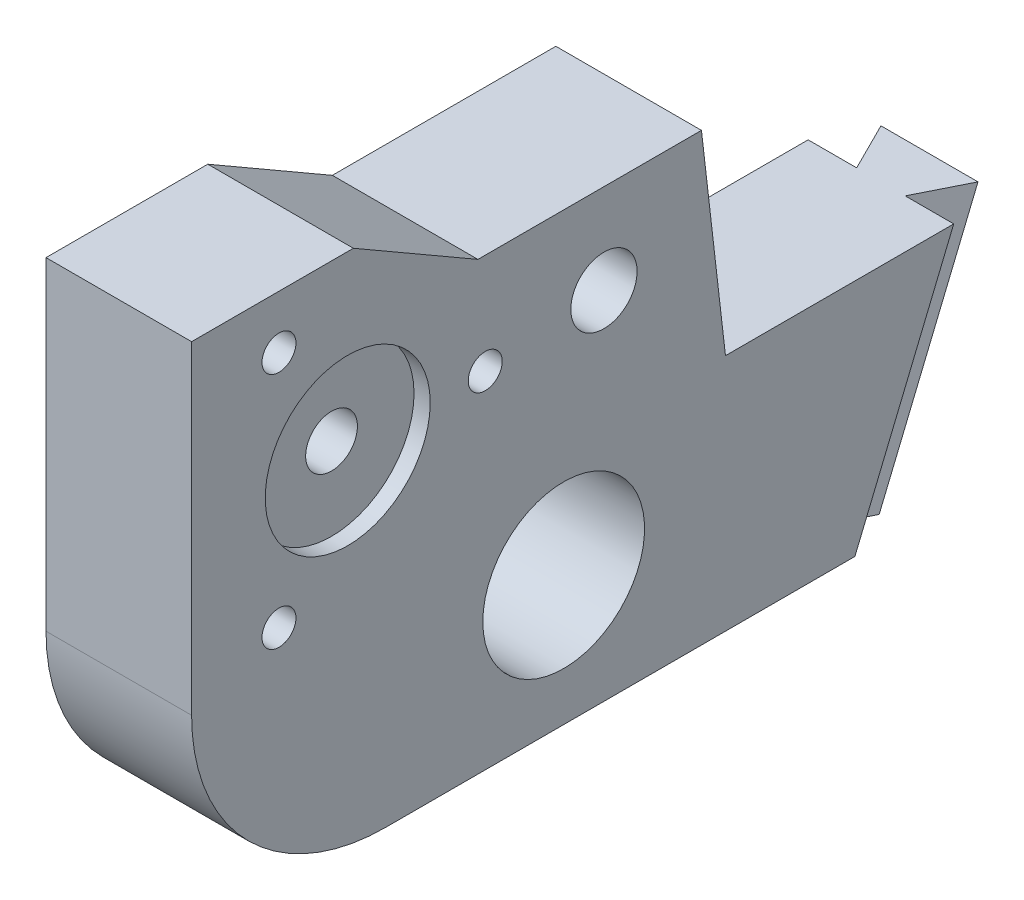
ISO-10303-21;
HEADER;
FILE_DESCRIPTION(('STEP AP214'),'2;1');
FILE_NAME('part.step','',(''),(''),'','','');
FILE_SCHEMA(('AUTOMOTIVE_DESIGN { 1 0 10303 214 1 1 1 1 }'));
ENDSEC;
DATA;
#1=APPLICATION_CONTEXT('core data for automotive mechanical design processes');
#2=APPLICATION_PROTOCOL_DEFINITION('international standard','automotive_design',2000,#1);
#3=PRODUCT_CONTEXT('',#1,'mechanical');
#4=PRODUCT('Part','Part','',(#3));
#5=PRODUCT_RELATED_PRODUCT_CATEGORY('part','',(#4));
#6=PRODUCT_DEFINITION_FORMATION('','',#4);
#7=PRODUCT_DEFINITION_CONTEXT('part definition',#1,'design');
#8=PRODUCT_DEFINITION('design','',#6,#7);
#9=PRODUCT_DEFINITION_SHAPE('','',#8);
#10=(LENGTH_UNIT() NAMED_UNIT(*) SI_UNIT(.MILLI.,.METRE.));
#11=(NAMED_UNIT(*) PLANE_ANGLE_UNIT() SI_UNIT($,.RADIAN.));
#12=(NAMED_UNIT(*) SI_UNIT($,.STERADIAN.) SOLID_ANGLE_UNIT());
#13=UNCERTAINTY_MEASURE_WITH_UNIT(LENGTH_MEASURE(1.E-05),#10,'distance_accuracy_value','');
#14=(GEOMETRIC_REPRESENTATION_CONTEXT(3) GLOBAL_UNCERTAINTY_ASSIGNED_CONTEXT((#13)) GLOBAL_UNIT_ASSIGNED_CONTEXT((#10,
#11,#12)) REPRESENTATION_CONTEXT('',''));
#15=CARTESIAN_POINT('',(0.,0.,0.));
#16=DIRECTION('',(0.,0.,1.));
#17=DIRECTION('',(1.,0.,0.));
#18=AXIS2_PLACEMENT_3D('',#15,#16,#17);
#19=CARTESIAN_POINT('',(7.,0.,0.));
#20=DIRECTION('',(-1.,0.,0.));
#21=DIRECTION('',(0.,0.,1.));
#22=AXIS2_PLACEMENT_3D('',#19,#20,#21);
#23=PLANE('',#22);
#24=CARTESIAN_POINT('',(7.,0.,28.));
#25=DIRECTION('',(-1.,0.,0.));
#26=DIRECTION('',(0.,0.,1.));
#27=AXIS2_PLACEMENT_3D('',#24,#25,#26);
#28=CIRCLE('',#27,5.);
#29=CARTESIAN_POINT('',(7.,0.,33.));
#30=VERTEX_POINT('',#29);
#31=EDGE_CURVE('E184',#30,#30,#28,.T.);
#32=ORIENTED_EDGE('',*,*,#31,.T.);
#33=EDGE_LOOP('',(#32));
#34=FACE_BOUND('',#33,.T.);
#35=CARTESIAN_POINT('',(7.,5.98854455980905,45.5997604919769));
#36=DIRECTION('',(-1.,0.,0.));
#37=DIRECTION('',(0.,0.,1.));
#38=AXIS2_PLACEMENT_3D('',#35,#36,#37);
#39=CIRCLE('',#38,1.05);
#40=CARTESIAN_POINT('',(7.,5.98854455980905,46.6497604919769));
#41=VERTEX_POINT('',#40);
#42=EDGE_CURVE('E233',#41,#41,#39,.T.);
#43=ORIENTED_EDGE('',*,*,#42,.T.);
#44=EDGE_LOOP('',(#43));
#45=FACE_BOUND('',#44,.T.);
#46=CARTESIAN_POINT('',(7.,20.7109764241445,45.5997604919769));
#47=DIRECTION('',(-1.,0.,0.));
#48=DIRECTION('',(0.,0.,1.));
#49=AXIS2_PLACEMENT_3D('',#46,#47,#48);
#50=CIRCLE('',#49,1.05);
#51=CARTESIAN_POINT('',(7.,20.7109764241445,46.6497604919769));
#52=VERTEX_POINT('',#51);
#53=EDGE_CURVE('E247',#52,#52,#50,.T.);
#54=ORIENTED_EDGE('',*,*,#53,.T.);
#55=EDGE_LOOP('',(#54));
#56=FACE_BOUND('',#55,.T.);
#57=CARTESIAN_POINT('',(7.,13.3497604919768,32.8497604919769));
#58=DIRECTION('',(-1.,0.,0.));
#59=DIRECTION('',(0.,0.,1.));
#60=AXIS2_PLACEMENT_3D('',#57,#58,#59);
#61=CIRCLE('',#60,1.05);
#62=CARTESIAN_POINT('',(7.,13.3497604919768,33.8997604919769));
#63=VERTEX_POINT('',#62);
#64=EDGE_CURVE('E259',#63,#63,#61,.T.);
#65=ORIENTED_EDGE('',*,*,#64,.T.);
#66=EDGE_LOOP('',(#65));
#67=FACE_BOUND('',#66,.T.);
#68=CARTESIAN_POINT('',(7.,13.3497604919768,41.3497604919769));
#69=DIRECTION('',(1.,0.,0.));
#70=DIRECTION('',(0.,0.,-1.));
#71=AXIS2_PLACEMENT_3D('',#68,#69,#70);
#72=CIRCLE('',#71,5.09999999999999);
#73=CARTESIAN_POINT('',(7.,13.3497604919768,36.2497604919769));
#74=VERTEX_POINT('',#73);
#75=EDGE_CURVE('E280',#74,#74,#72,.T.);
#76=ORIENTED_EDGE('',*,*,#75,.F.);
#77=EDGE_LOOP('',(#76));
#78=FACE_BOUND('',#77,.T.);
#79=CARTESIAN_POINT('',(7.,14.,25.5107624657242));
#80=DIRECTION('',(-1.,0.,0.));
#81=DIRECTION('',(0.,0.,1.));
#82=AXIS2_PLACEMENT_3D('',#79,#80,#81);
#83=CIRCLE('',#82,2.05);
#84=CARTESIAN_POINT('',(7.,14.,27.5607624657242));
#85=VERTEX_POINT('',#84);
#86=EDGE_CURVE('E283',#85,#85,#83,.T.);
#87=ORIENTED_EDGE('',*,*,#86,.T.);
#88=EDGE_LOOP('',(#87));
#89=FACE_BOUND('',#88,.T.);
#90=DIRECTION('',(0.,0.,-1.));
#91=VECTOR('',#90,1.);
#92=CARTESIAN_POINT('',(7.,19.5546522376059,0.));
#93=LINE('',#92,#91);
#94=CARTESIAN_POINT('',(7.,19.5546522376059,33.3004318182208));
#95=VERTEX_POINT('',#94);
#96=CARTESIAN_POINT('',(7.,19.5546522376059,19.4845973608818));
#97=VERTEX_POINT('',#96);
#98=EDGE_CURVE('E52',#95,#97,#93,.T.);
#99=ORIENTED_EDGE('',*,*,#98,.F.);
#100=DIRECTION('',(0.,-0.5,-0.866025403784438));
#101=VECTOR('',#100,1.);
#102=CARTESIAN_POINT('',(7.,0.246479222419,-0.14230484541326));
#103=LINE('',#102,#101);
#104=CARTESIAN_POINT('',(7.,24.,41.));
#105=VERTEX_POINT('',#104);
#106=EDGE_CURVE('E56',#105,#95,#103,.T.);
#107=ORIENTED_EDGE('',*,*,#106,.F.);
#108=DIRECTION('',(0.,0.,-1.));
#109=VECTOR('',#108,1.);
#110=CARTESIAN_POINT('',(7.,24.,51.));
#111=LINE('',#110,#109);
#112=CARTESIAN_POINT('',(7.,24.,51.));
#113=VERTEX_POINT('',#112);
#114=EDGE_CURVE('E176',#113,#105,#111,.T.);
#115=ORIENTED_EDGE('',*,*,#114,.F.);
#116=DIRECTION('',(0.,1.,0.));
#117=VECTOR('',#116,1.);
#118=CARTESIAN_POINT('',(7.,-7.99999999999999,51.));
#119=LINE('',#118,#117);
#120=CARTESIAN_POINT('',(7.,4.00000000000001,51.));
#121=VERTEX_POINT('',#120);
#122=EDGE_CURVE('E170',#121,#113,#119,.T.);
#123=ORIENTED_EDGE('',*,*,#122,.F.);
#124=CARTESIAN_POINT('',(7.,4.00000000000001,39.));
#125=DIRECTION('',(-1.,0.,0.));
#126=DIRECTION('',(0.,0.,1.));
#127=AXIS2_PLACEMENT_3D('',#124,#125,#126);
#128=CIRCLE('',#127,12.);
#129=CARTESIAN_POINT('',(7.,-7.99999999999999,39.));
#130=VERTEX_POINT('',#129);
#131=EDGE_CURVE('E153',#121,#130,#128,.F.);
#132=ORIENTED_EDGE('',*,*,#131,.T.);
#133=DIRECTION('',(0.,0.,1.));
#134=VECTOR('',#133,1.);
#135=CARTESIAN_POINT('',(7.,-7.99999999999999,-1.));
#136=LINE('',#135,#134);
#137=CARTESIAN_POINT('',(7.,-7.99999999999999,10.));
#138=VERTEX_POINT('',#137);
#139=EDGE_CURVE('E167',#138,#130,#136,.T.);
#140=ORIENTED_EDGE('',*,*,#139,.F.);
#141=DIRECTION('',(0.,0.923879532511289,-0.382683432365084));
#142=VECTOR('',#141,1.);
#143=CARTESIAN_POINT('',(7.,-9.0014606622062,10.4148185884689));
#144=LINE('',#143,#142);
#145=CARTESIAN_POINT('',(7.,6.75,3.89034995499696));
#146=VERTEX_POINT('',#145);
#147=EDGE_CURVE('E221',#138,#146,#144,.T.);
#148=ORIENTED_EDGE('',*,*,#147,.T.);
#149=DIRECTION('',(0.,0.,-1.));
#150=VECTOR('',#149,1.);
#151=CARTESIAN_POINT('',(7.,6.75,-4.00000000000001));
#152=LINE('',#151,#150);
#153=CARTESIAN_POINT('',(7.,6.75,18.));
#154=VERTEX_POINT('',#153);
#155=EDGE_CURVE('E140',#154,#146,#152,.T.);
#156=ORIENTED_EDGE('',*,*,#155,.F.);
#157=DIRECTION('',(0.,-0.993345736033198,-0.115170520119791));
#158=VECTOR('',#157,1.);
#159=CARTESIAN_POINT('',(7.,6.75,18.));
#160=LINE('',#159,#158);
#161=EDGE_CURVE('E182',#97,#154,#160,.T.);
#162=ORIENTED_EDGE('',*,*,#161,.F.);
#163=EDGE_LOOP('',(#99,#107,#115,#123,#132,#140,#148,#156,#162));
#164=FACE_BOUND('',#163,.T.);
#165=ADVANCED_FACE('F37',(#34,#45,#56,#67,#78,#89,#164),#23,.F.);
#166=CARTESIAN_POINT('',(-2.,0.,0.));
#167=DIRECTION('',(-1.,0.,0.));
#168=DIRECTION('',(0.,0.,1.));
#169=AXIS2_PLACEMENT_3D('',#166,#167,#168);
#170=PLANE('',#169);
#171=CARTESIAN_POINT('',(-2.,14.,25.5107624657242));
#172=DIRECTION('',(-1.,0.,0.));
#173=DIRECTION('',(0.,0.,1.));
#174=AXIS2_PLACEMENT_3D('',#171,#172,#173);
#175=CIRCLE('',#174,2.04999999999999);
#176=CARTESIAN_POINT('',(-2.,14.,27.5607624657242));
#177=VERTEX_POINT('',#176);
#178=EDGE_CURVE('E286',#177,#177,#175,.T.);
#179=ORIENTED_EDGE('',*,*,#178,.F.);
#180=EDGE_LOOP('',(#179));
#181=FACE_BOUND('',#180,.T.);
#182=CARTESIAN_POINT('',(-2.,13.3497604919768,41.3497604919769));
#183=DIRECTION('',(1.,0.,0.));
#184=DIRECTION('',(0.,0.,-1.));
#185=AXIS2_PLACEMENT_3D('',#182,#183,#184);
#186=CIRCLE('',#185,1.6);
#187=CARTESIAN_POINT('',(-2.,13.3497604919768,39.7497604919769));
#188=VERTEX_POINT('',#187);
#189=EDGE_CURVE('E271',#188,#188,#186,.T.);
#190=ORIENTED_EDGE('',*,*,#189,.T.);
#191=EDGE_LOOP('',(#190));
#192=FACE_BOUND('',#191,.T.);
#193=CARTESIAN_POINT('',(-2.,13.3497604919768,32.8497604919769));
#194=DIRECTION('',(-1.,0.,0.));
#195=DIRECTION('',(0.,0.,1.));
#196=AXIS2_PLACEMENT_3D('',#193,#194,#195);
#197=CIRCLE('',#196,1.65);
#198=CARTESIAN_POINT('',(-2.,13.3497604919768,34.4997604919769));
#199=VERTEX_POINT('',#198);
#200=EDGE_CURVE('E268',#199,#199,#197,.T.);
#201=ORIENTED_EDGE('',*,*,#200,.F.);
#202=EDGE_LOOP('',(#201));
#203=FACE_BOUND('',#202,.T.);
#204=CARTESIAN_POINT('',(-2.,20.7109764241445,45.5997604919769));
#205=DIRECTION('',(-1.,0.,0.));
#206=DIRECTION('',(0.,0.,1.));
#207=AXIS2_PLACEMENT_3D('',#204,#205,#206);
#208=CIRCLE('',#207,1.65);
#209=CARTESIAN_POINT('',(-2.,20.7109764241445,47.2497604919769));
#210=VERTEX_POINT('',#209);
#211=EDGE_CURVE('E256',#210,#210,#208,.T.);
#212=ORIENTED_EDGE('',*,*,#211,.F.);
#213=EDGE_LOOP('',(#212));
#214=FACE_BOUND('',#213,.T.);
#215=CARTESIAN_POINT('',(-2.,5.98854455980905,45.5997604919769));
#216=DIRECTION('',(-1.,0.,0.));
#217=DIRECTION('',(0.,0.,1.));
#218=AXIS2_PLACEMENT_3D('',#215,#216,#217);
#219=CIRCLE('',#218,1.65);
#220=CARTESIAN_POINT('',(-2.,5.98854455980905,47.2497604919769));
#221=VERTEX_POINT('',#220);
#222=EDGE_CURVE('E244',#221,#221,#219,.T.);
#223=ORIENTED_EDGE('',*,*,#222,.F.);
#224=EDGE_LOOP('',(#223));
#225=FACE_BOUND('',#224,.T.);
#226=CARTESIAN_POINT('',(-2.,0.,28.));
#227=DIRECTION('',(-1.,0.,0.));
#228=DIRECTION('',(0.,0.,1.));
#229=AXIS2_PLACEMENT_3D('',#226,#227,#228);
#230=CIRCLE('',#229,4.99999999999999);
#231=CARTESIAN_POINT('',(-2.,0.,33.));
#232=VERTEX_POINT('',#231);
#233=EDGE_CURVE('E188',#232,#232,#230,.T.);
#234=ORIENTED_EDGE('',*,*,#233,.F.);
#235=EDGE_LOOP('',(#234));
#236=FACE_BOUND('',#235,.T.);
#237=DIRECTION('',(0.,-0.5,-0.866025403784438));
#238=VECTOR('',#237,1.);
#239=CARTESIAN_POINT('',(-2.,0.246479222419,-0.14230484541326));
#240=LINE('',#239,#238);
#241=CARTESIAN_POINT('',(-2.,24.,41.));
#242=VERTEX_POINT('',#241);
#243=CARTESIAN_POINT('',(-2.,19.5546522376059,33.3004318182208));
#244=VERTEX_POINT('',#243);
#245=EDGE_CURVE('E11',#242,#244,#240,.T.);
#246=ORIENTED_EDGE('',*,*,#245,.T.);
#247=DIRECTION('',(0.,0.,-1.));
#248=VECTOR('',#247,1.);
#249=CARTESIAN_POINT('',(-2.,19.5546522376059,0.));
#250=LINE('',#249,#248);
#251=CARTESIAN_POINT('',(-2.,19.5546522376059,19.4845973608818));
#252=VERTEX_POINT('',#251);
#253=EDGE_CURVE('E143',#244,#252,#250,.T.);
#254=ORIENTED_EDGE('',*,*,#253,.T.);
#255=DIRECTION('',(0.,-0.993345736033198,-0.115170520119791));
#256=VECTOR('',#255,1.);
#257=CARTESIAN_POINT('',(-2.,6.75,18.));
#258=LINE('',#257,#256);
#259=CARTESIAN_POINT('',(-2.,6.75,18.));
#260=VERTEX_POINT('',#259);
#261=EDGE_CURVE('E130',#252,#260,#258,.T.);
#262=ORIENTED_EDGE('',*,*,#261,.T.);
#263=DIRECTION('',(0.,0.,-1.));
#264=VECTOR('',#263,1.);
#265=CARTESIAN_POINT('',(-2.,6.75,-4.00000000000001));
#266=LINE('',#265,#264);
#267=CARTESIAN_POINT('',(-2.,6.75,3.89034995499696));
#268=VERTEX_POINT('',#267);
#269=EDGE_CURVE('E139',#260,#268,#266,.T.);
#270=ORIENTED_EDGE('',*,*,#269,.T.);
#271=DIRECTION('',(0.,0.923879532511289,-0.382683432365084));
#272=VECTOR('',#271,1.);
#273=CARTESIAN_POINT('',(-2.,-9.0014606622062,10.4148185884689));
#274=LINE('',#273,#272);
#275=CARTESIAN_POINT('',(-2.,-7.99999999999999,10.));
#276=VERTEX_POINT('',#275);
#277=EDGE_CURVE('E198',#276,#268,#274,.T.);
#278=ORIENTED_EDGE('',*,*,#277,.F.);
#279=DIRECTION('',(0.,0.,1.));
#280=VECTOR('',#279,1.);
#281=CARTESIAN_POINT('',(-2.,-7.99999999999999,-1.));
#282=LINE('',#281,#280);
#283=CARTESIAN_POINT('',(-2.,-7.99999999999999,39.));
#284=VERTEX_POINT('',#283);
#285=EDGE_CURVE('E168',#276,#284,#282,.T.);
#286=ORIENTED_EDGE('',*,*,#285,.T.);
#287=CARTESIAN_POINT('',(-2.,4.00000000000001,39.));
#288=DIRECTION('',(-1.,0.,0.));
#289=DIRECTION('',(0.,0.,1.));
#290=AXIS2_PLACEMENT_3D('',#287,#288,#289);
#291=CIRCLE('',#290,12.);
#292=CARTESIAN_POINT('',(-2.,4.00000000000001,51.));
#293=VERTEX_POINT('',#292);
#294=EDGE_CURVE('E159',#284,#293,#291,.T.);
#295=ORIENTED_EDGE('',*,*,#294,.T.);
#296=DIRECTION('',(0.,1.,0.));
#297=VECTOR('',#296,1.);
#298=CARTESIAN_POINT('',(-2.,-7.99999999999999,51.));
#299=LINE('',#298,#297);
#300=CARTESIAN_POINT('',(-2.,24.,51.));
#301=VERTEX_POINT('',#300);
#302=EDGE_CURVE('E173',#293,#301,#299,.T.);
#303=ORIENTED_EDGE('',*,*,#302,.T.);
#304=DIRECTION('',(0.,0.,-1.));
#305=VECTOR('',#304,1.);
#306=CARTESIAN_POINT('',(-2.,24.,51.));
#307=LINE('',#306,#305);
#308=EDGE_CURVE('E171',#301,#242,#307,.T.);
#309=ORIENTED_EDGE('',*,*,#308,.T.);
#310=EDGE_LOOP('',(#246,#254,#262,#270,#278,#286,#295,#303,#309));
#311=FACE_BOUND('',#310,.T.);
#312=ADVANCED_FACE('F144',(#181,#192,#203,#214,#225,#236,#311),#170,.T.);
#313=CARTESIAN_POINT('',(-2.,6.75,18.));
#314=DIRECTION('',(0.,-0.115170520119791,0.993345736033198));
#315=DIRECTION('',(0.,-0.993345736033198,-0.115170520119791));
#316=AXIS2_PLACEMENT_3D('',#313,#314,#315);
#317=PLANE('',#316);
#318=DIRECTION('',(-1.,0.,0.));
#319=VECTOR('',#318,1.);
#320=CARTESIAN_POINT('',(-2.,19.5546522376059,19.4845973608818));
#321=LINE('',#320,#319);
#322=EDGE_CURVE('E45',#97,#252,#321,.T.);
#323=ORIENTED_EDGE('',*,*,#322,.F.);
#324=ORIENTED_EDGE('',*,*,#161,.T.);
#325=DIRECTION('',(1.,0.,0.));
#326=VECTOR('',#325,1.);
#327=CARTESIAN_POINT('',(-2.,6.75,18.));
#328=LINE('',#327,#326);
#329=EDGE_CURVE('E135',#260,#154,#328,.T.);
#330=ORIENTED_EDGE('',*,*,#329,.F.);
#331=ORIENTED_EDGE('',*,*,#261,.F.);
#332=EDGE_LOOP('',(#323,#324,#330,#331));
#333=FACE_BOUND('',#332,.T.);
#334=ADVANCED_FACE('F132',(#333),#317,.F.);
#335=CARTESIAN_POINT('',(7.,-7.99999999999999,51.));
#336=DIRECTION('',(0.,0.,1.));
#337=DIRECTION('',(1.,0.,0.));
#338=AXIS2_PLACEMENT_3D('',#335,#336,#337);
#339=PLANE('',#338);
#340=ORIENTED_EDGE('',*,*,#302,.F.);
#341=DIRECTION('',(-1.,0.,0.));
#342=VECTOR('',#341,1.);
#343=CARTESIAN_POINT('',(7.,4.00000000000001,51.));
#344=LINE('',#343,#342);
#345=EDGE_CURVE('E155',#293,#121,#344,.F.);
#346=ORIENTED_EDGE('',*,*,#345,.T.);
#347=ORIENTED_EDGE('',*,*,#122,.T.);
#348=DIRECTION('',(-1.,0.,0.));
#349=VECTOR('',#348,1.);
#350=CARTESIAN_POINT('',(7.,24.,51.));
#351=LINE('',#350,#349);
#352=EDGE_CURVE('E164',#113,#301,#351,.T.);
#353=ORIENTED_EDGE('',*,*,#352,.T.);
#354=EDGE_LOOP('',(#340,#346,#347,#353));
#355=FACE_BOUND('',#354,.T.);
#356=ADVANCED_FACE('F304',(#355),#339,.T.);
#357=CARTESIAN_POINT('',(7.,-7.99999999999999,-1.));
#358=DIRECTION('',(0.,-1.,0.));
#359=DIRECTION('',(0.,0.,-1.));
#360=AXIS2_PLACEMENT_3D('',#357,#358,#359);
#361=PLANE('',#360);
#362=DIRECTION('',(-1.,0.,0.));
#363=VECTOR('',#362,1.);
#364=CARTESIAN_POINT('',(7.,-7.99999999999999,6.99999999999997));
#365=LINE('',#364,#363);
#366=CARTESIAN_POINT('',(5.50000000000001,-7.99999999999999,6.99999999999997));
#367=VERTEX_POINT('',#366);
#368=CARTESIAN_POINT('',(-0.5,-7.99999999999999,6.99999999999997));
#369=VERTEX_POINT('',#368);
#370=EDGE_CURVE('E231',#367,#369,#365,.T.);
#371=ORIENTED_EDGE('',*,*,#370,.F.);
#372=DIRECTION('',(0.447213595499958,0.,-0.894427190999916));
#373=VECTOR('',#372,1.);
#374=CARTESIAN_POINT('',(3.83407256461242,-7.99999999999999,10.3318548707752));
#375=LINE('',#374,#373);
#376=CARTESIAN_POINT('',(4.,-7.99999999999999,10.));
#377=VERTEX_POINT('',#376);
#378=EDGE_CURVE('E213',#377,#367,#375,.T.);
#379=ORIENTED_EDGE('',*,*,#378,.F.);
#380=DIRECTION('',(-1.,0.,0.));
#381=VECTOR('',#380,1.);
#382=CARTESIAN_POINT('',(4.,-7.99999999999999,10.));
#383=LINE('',#382,#381);
#384=EDGE_CURVE('E224',#138,#377,#383,.T.);
#385=ORIENTED_EDGE('',*,*,#384,.F.);
#386=ORIENTED_EDGE('',*,*,#139,.T.);
#387=DIRECTION('',(-1.,0.,0.));
#388=VECTOR('',#387,1.);
#389=CARTESIAN_POINT('',(7.,-7.99999999999999,39.));
#390=LINE('',#389,#388);
#391=EDGE_CURVE('E161',#130,#284,#390,.T.);
#392=ORIENTED_EDGE('',*,*,#391,.T.);
#393=ORIENTED_EDGE('',*,*,#285,.F.);
#394=DIRECTION('',(-1.,0.,0.));
#395=VECTOR('',#394,1.);
#396=CARTESIAN_POINT('',(1.,-7.99999999999999,10.));
#397=LINE('',#396,#395);
#398=CARTESIAN_POINT('',(1.,-7.99999999999999,10.));
#399=VERTEX_POINT('',#398);
#400=EDGE_CURVE('E203',#399,#276,#397,.T.);
#401=ORIENTED_EDGE('',*,*,#400,.F.);
#402=DIRECTION('',(0.447213595499958,0.,0.894427190999916));
#403=VECTOR('',#402,1.);
#404=CARTESIAN_POINT('',(1.16592743538758,-7.99999999999999,10.3318548707752));
#405=LINE('',#404,#403);
#406=EDGE_CURVE('E200',#369,#399,#405,.T.);
#407=ORIENTED_EDGE('',*,*,#406,.F.);
#408=EDGE_LOOP('',(#371,#379,#385,#386,#392,#393,#401,#407));
#409=FACE_BOUND('',#408,.T.);
#410=ADVANCED_FACE('F313',(#409),#361,.T.);
#411=CARTESIAN_POINT('',(7.,24.,51.));
#412=DIRECTION('',(0.,1.,0.));
#413=DIRECTION('',(0.,0.,1.));
#414=AXIS2_PLACEMENT_3D('',#411,#412,#413);
#415=PLANE('',#414);
#416=DIRECTION('',(1.,0.,0.));
#417=VECTOR('',#416,1.);
#418=CARTESIAN_POINT('',(-77.1662431259941,24.,41.));
#419=LINE('',#418,#417);
#420=EDGE_CURVE('E292',#242,#105,#419,.T.);
#421=ORIENTED_EDGE('',*,*,#420,.F.);
#422=ORIENTED_EDGE('',*,*,#308,.F.);
#423=ORIENTED_EDGE('',*,*,#352,.F.);
#424=ORIENTED_EDGE('',*,*,#114,.T.);
#425=EDGE_LOOP('',(#421,#422,#423,#424));
#426=FACE_BOUND('',#425,.T.);
#427=ADVANCED_FACE('F298',(#426),#415,.T.);
#428=CARTESIAN_POINT('',(-2.,6.75,-4.00000000000001));
#429=DIRECTION('',(0.,-1.,0.));
#430=DIRECTION('',(0.,0.,-1.));
#431=AXIS2_PLACEMENT_3D('',#428,#429,#430);
#432=PLANE('',#431);
#433=DIRECTION('',(0.447213595499958,0.,-0.894427190999916));
#434=VECTOR('',#433,1.);
#435=CARTESIAN_POINT('',(1.3902125466112,6.75,9.10992486177455));
#436=LINE('',#435,#434);
#437=CARTESIAN_POINT('',(4.,6.75,3.89034995499696));
#438=VERTEX_POINT('',#437);
#439=CARTESIAN_POINT('',(5.5,6.75,0.890349954996955));
#440=VERTEX_POINT('',#439);
#441=EDGE_CURVE('E195',#438,#440,#436,.T.);
#442=ORIENTED_EDGE('',*,*,#441,.T.);
#443=DIRECTION('',(-1.,0.,0.));
#444=VECTOR('',#443,1.);
#445=CARTESIAN_POINT('',(7.,6.75,0.890349954996931));
#446=LINE('',#445,#444);
#447=CARTESIAN_POINT('',(-0.5,6.75,0.890349954996931));
#448=VERTEX_POINT('',#447);
#449=EDGE_CURVE('E218',#440,#448,#446,.T.);
#450=ORIENTED_EDGE('',*,*,#449,.T.);
#451=DIRECTION('',(0.447213595499958,0.,0.894427190999916));
#452=VECTOR('',#451,1.);
#453=CARTESIAN_POINT('',(3.6097874533888,6.75,9.10992486177455));
#454=LINE('',#453,#452);
#455=CARTESIAN_POINT('',(1.,6.75,3.89034995499696));
#456=VERTEX_POINT('',#455);
#457=EDGE_CURVE('E205',#448,#456,#454,.T.);
#458=ORIENTED_EDGE('',*,*,#457,.T.);
#459=DIRECTION('',(-1.,0.,0.));
#460=VECTOR('',#459,1.);
#461=CARTESIAN_POINT('',(1.,6.75,3.89034995499696));
#462=LINE('',#461,#460);
#463=EDGE_CURVE('E191',#456,#268,#462,.T.);
#464=ORIENTED_EDGE('',*,*,#463,.T.);
#465=ORIENTED_EDGE('',*,*,#269,.F.);
#466=ORIENTED_EDGE('',*,*,#329,.T.);
#467=ORIENTED_EDGE('',*,*,#155,.T.);
#468=DIRECTION('',(-1.,0.,0.));
#469=VECTOR('',#468,1.);
#470=CARTESIAN_POINT('',(4.,6.75,3.89034995499696));
#471=LINE('',#470,#469);
#472=EDGE_CURVE('E210',#146,#438,#471,.T.);
#473=ORIENTED_EDGE('',*,*,#472,.T.);
#474=EDGE_LOOP('',(#442,#450,#458,#464,#465,#466,#467,#473));
#475=FACE_BOUND('',#474,.T.);
#476=ADVANCED_FACE('F320',(#475),#432,.F.);
#477=CARTESIAN_POINT('',(-2.,0.,28.));
#478=DIRECTION('',(-1.,0.,0.));
#479=DIRECTION('',(0.,0.,1.));
#480=AXIS2_PLACEMENT_3D('',#477,#478,#479);
#481=CYLINDRICAL_SURFACE('',#480,4.99999999999999);
#482=ORIENTED_EDGE('',*,*,#31,.F.);
#483=EDGE_LOOP('',(#482));
#484=FACE_BOUND('',#483,.T.);
#485=ORIENTED_EDGE('',*,*,#233,.T.);
#486=EDGE_LOOP('',(#485));
#487=FACE_BOUND('',#486,.T.);
#488=ADVANCED_FACE('F536',(#484,#487),#481,.F.);
#489=CARTESIAN_POINT('',(7.,4.00000000000001,39.));
#490=DIRECTION('',(-1.,0.,0.));
#491=DIRECTION('',(0.,0.,1.));
#492=AXIS2_PLACEMENT_3D('',#489,#490,#491);
#493=CYLINDRICAL_SURFACE('',#492,12.);
#494=ORIENTED_EDGE('',*,*,#131,.F.);
#495=ORIENTED_EDGE('',*,*,#345,.F.);
#496=ORIENTED_EDGE('',*,*,#294,.F.);
#497=ORIENTED_EDGE('',*,*,#391,.F.);
#498=EDGE_LOOP('',(#494,#495,#496,#497));
#499=FACE_BOUND('',#498,.T.);
#500=ADVANCED_FACE('F39',(#499),#493,.T.);
#501=CARTESIAN_POINT('',(1.,-9.0014606622062,10.4148185884689));
#502=DIRECTION('',(0.,-0.382683432365084,-0.923879532511289));
#503=DIRECTION('',(0.,0.923879532511289,-0.382683432365084));
#504=AXIS2_PLACEMENT_3D('',#501,#502,#503);
#505=PLANE('',#504);
#506=DIRECTION('',(0.,0.923879532511289,-0.382683432365084));
#507=VECTOR('',#506,1.);
#508=CARTESIAN_POINT('',(1.,-9.0014606622062,10.4148185884689));
#509=LINE('',#508,#507);
#510=EDGE_CURVE('E194',#399,#456,#509,.T.);
#511=ORIENTED_EDGE('',*,*,#510,.F.);
#512=ORIENTED_EDGE('',*,*,#400,.T.);
#513=ORIENTED_EDGE('',*,*,#277,.T.);
#514=ORIENTED_EDGE('',*,*,#463,.F.);
#515=EDGE_LOOP('',(#511,#512,#513,#514));
#516=FACE_BOUND('',#515,.T.);
#517=ADVANCED_FACE('F323',(#516),#505,.T.);
#518=CARTESIAN_POINT('',(1.,-9.0014606622062,10.4148185884689));
#519=DIRECTION('',(-0.87946522406461,0.182143211721524,0.439732612032305));
#520=DIRECTION('',(0.447213595499958,0.,0.894427190999916));
#521=AXIS2_PLACEMENT_3D('',#518,#519,#520);
#522=PLANE('',#521);
#523=DIRECTION('',(0.,0.923879532511289,-0.382683432365084));
#524=VECTOR('',#523,1.);
#525=CARTESIAN_POINT('',(-0.5,-9.0014606622062,7.41481858846895));
#526=LINE('',#525,#524);
#527=EDGE_CURVE('E192',#369,#448,#526,.T.);
#528=ORIENTED_EDGE('',*,*,#527,.F.);
#529=ORIENTED_EDGE('',*,*,#406,.T.);
#530=ORIENTED_EDGE('',*,*,#510,.T.);
#531=ORIENTED_EDGE('',*,*,#457,.F.);
#532=EDGE_LOOP('',(#528,#529,#530,#531));
#533=FACE_BOUND('',#532,.T.);
#534=ADVANCED_FACE('F327',(#533),#522,.T.);
#535=CARTESIAN_POINT('',(4.,-9.0014606622062,10.4148185884689));
#536=DIRECTION('',(0.,-0.382683432365084,-0.923879532511289));
#537=DIRECTION('',(0.,0.923879532511289,-0.382683432365084));
#538=AXIS2_PLACEMENT_3D('',#535,#536,#537);
#539=PLANE('',#538);
#540=ORIENTED_EDGE('',*,*,#147,.F.);
#541=ORIENTED_EDGE('',*,*,#384,.T.);
#542=DIRECTION('',(0.,0.923879532511289,-0.382683432365084));
#543=VECTOR('',#542,1.);
#544=CARTESIAN_POINT('',(4.,-9.0014606622062,10.4148185884689));
#545=LINE('',#544,#543);
#546=EDGE_CURVE('E214',#377,#438,#545,.T.);
#547=ORIENTED_EDGE('',*,*,#546,.T.);
#548=ORIENTED_EDGE('',*,*,#472,.F.);
#549=EDGE_LOOP('',(#540,#541,#547,#548));
#550=FACE_BOUND('',#549,.T.);
#551=ADVANCED_FACE('F333',(#550),#539,.T.);
#552=CARTESIAN_POINT('',(4.,-9.0014606622062,10.4148185884689));
#553=DIRECTION('',(0.87946522406461,0.182143211721524,0.439732612032305));
#554=DIRECTION('',(0.447213595499958,0.,-0.894427190999916));
#555=AXIS2_PLACEMENT_3D('',#552,#553,#554);
#556=PLANE('',#555);
#557=ORIENTED_EDGE('',*,*,#546,.F.);
#558=ORIENTED_EDGE('',*,*,#378,.T.);
#559=DIRECTION('',(0.,0.923879532511289,-0.382683432365084));
#560=VECTOR('',#559,1.);
#561=CARTESIAN_POINT('',(5.5,-9.0014606622062,7.41481858846895));
#562=LINE('',#561,#560);
#563=EDGE_CURVE('E217',#367,#440,#562,.T.);
#564=ORIENTED_EDGE('',*,*,#563,.T.);
#565=ORIENTED_EDGE('',*,*,#441,.F.);
#566=EDGE_LOOP('',(#557,#558,#564,#565));
#567=FACE_BOUND('',#566,.T.);
#568=ADVANCED_FACE('F332',(#567),#556,.T.);
#569=CARTESIAN_POINT('',(7.,-7.99999999999999,6.99999999999997));
#570=DIRECTION('',(0.,0.382683432365084,0.923879532511289));
#571=DIRECTION('',(0.,-0.923879532511289,0.382683432365084));
#572=AXIS2_PLACEMENT_3D('',#569,#570,#571);
#573=PLANE('',#572);
#574=ORIENTED_EDGE('',*,*,#527,.T.);
#575=ORIENTED_EDGE('',*,*,#449,.F.);
#576=ORIENTED_EDGE('',*,*,#563,.F.);
#577=ORIENTED_EDGE('',*,*,#370,.T.);
#578=EDGE_LOOP('',(#574,#575,#576,#577));
#579=FACE_BOUND('',#578,.T.);
#580=ADVANCED_FACE('F330',(#579),#573,.F.);
#581=CARTESIAN_POINT('',(-2.,5.98854455980905,45.5997604919769));
#582=DIRECTION('',(-1.,0.,0.));
#583=DIRECTION('',(0.,0.,1.));
#584=AXIS2_PLACEMENT_3D('',#581,#582,#583);
#585=CYLINDRICAL_SURFACE('',#584,1.05);
#586=ORIENTED_EDGE('',*,*,#42,.F.);
#587=EDGE_LOOP('',(#586));
#588=FACE_BOUND('',#587,.T.);
#589=CARTESIAN_POINT('',(0.,5.98854455980905,45.5997604919769));
#590=DIRECTION('',(-1.,0.,0.));
#591=DIRECTION('',(0.,0.,1.));
#592=AXIS2_PLACEMENT_3D('',#589,#590,#591);
#593=CIRCLE('',#592,1.05);
#594=CARTESIAN_POINT('',(0.,5.98854455980905,46.6497604919769));
#595=VERTEX_POINT('',#594);
#596=EDGE_CURVE('E238',#595,#595,#593,.T.);
#597=ORIENTED_EDGE('',*,*,#596,.T.);
#598=EDGE_LOOP('',(#597));
#599=FACE_BOUND('',#598,.T.);
#600=ADVANCED_FACE('F495',(#588,#599),#585,.F.);
#601=CARTESIAN_POINT('',(0.,7.03854455980905,45.5997604919769));
#602=DIRECTION('',(1.,0.,0.));
#603=DIRECTION('',(0.,0.,-1.));
#604=AXIS2_PLACEMENT_3D('',#601,#602,#603);
#605=PLANE('',#604);
#606=ORIENTED_EDGE('',*,*,#596,.F.);
#607=EDGE_LOOP('',(#606));
#608=FACE_BOUND('',#607,.T.);
#609=CARTESIAN_POINT('',(0.,5.98854455980905,45.5997604919769));
#610=DIRECTION('',(-1.,0.,0.));
#611=DIRECTION('',(0.,0.,1.));
#612=AXIS2_PLACEMENT_3D('',#609,#610,#611);
#613=CIRCLE('',#612,1.65);
#614=CARTESIAN_POINT('',(0.,5.98854455980905,47.2497604919769));
#615=VERTEX_POINT('',#614);
#616=EDGE_CURVE('E241',#615,#615,#613,.T.);
#617=ORIENTED_EDGE('',*,*,#616,.T.);
#618=EDGE_LOOP('',(#617));
#619=FACE_BOUND('',#618,.T.);
#620=ADVANCED_FACE('F485',(#608,#619),#605,.F.);
#621=CARTESIAN_POINT('',(-2.,5.98854455980905,45.5997604919769));
#622=DIRECTION('',(-1.,0.,0.));
#623=DIRECTION('',(0.,0.,1.));
#624=AXIS2_PLACEMENT_3D('',#621,#622,#623);
#625=CYLINDRICAL_SURFACE('',#624,1.65);
#626=ORIENTED_EDGE('',*,*,#616,.F.);
#627=EDGE_LOOP('',(#626));
#628=FACE_BOUND('',#627,.T.);
#629=ORIENTED_EDGE('',*,*,#222,.T.);
#630=EDGE_LOOP('',(#629));
#631=FACE_BOUND('',#630,.T.);
#632=ADVANCED_FACE('F475',(#628,#631),#625,.F.);
#633=CARTESIAN_POINT('',(-2.,20.7109764241445,45.5997604919769));
#634=DIRECTION('',(-1.,0.,0.));
#635=DIRECTION('',(0.,0.,1.));
#636=AXIS2_PLACEMENT_3D('',#633,#634,#635);
#637=CYLINDRICAL_SURFACE('',#636,1.05);
#638=ORIENTED_EDGE('',*,*,#53,.F.);
#639=EDGE_LOOP('',(#638));
#640=FACE_BOUND('',#639,.T.);
#641=CARTESIAN_POINT('',(0.,20.7109764241445,45.5997604919769));
#642=DIRECTION('',(-1.,0.,0.));
#643=DIRECTION('',(0.,0.,1.));
#644=AXIS2_PLACEMENT_3D('',#641,#642,#643);
#645=CIRCLE('',#644,1.05);
#646=CARTESIAN_POINT('',(0.,20.7109764241445,46.6497604919769));
#647=VERTEX_POINT('',#646);
#648=EDGE_CURVE('E250',#647,#647,#645,.T.);
#649=ORIENTED_EDGE('',*,*,#648,.T.);
#650=EDGE_LOOP('',(#649));
#651=FACE_BOUND('',#650,.T.);
#652=ADVANCED_FACE('F465',(#640,#651),#637,.F.);
#653=CARTESIAN_POINT('',(0.,21.7609764241445,45.5997604919769));
#654=DIRECTION('',(1.,0.,0.));
#655=DIRECTION('',(0.,0.,-1.));
#656=AXIS2_PLACEMENT_3D('',#653,#654,#655);
#657=PLANE('',#656);
#658=ORIENTED_EDGE('',*,*,#648,.F.);
#659=EDGE_LOOP('',(#658));
#660=FACE_BOUND('',#659,.T.);
#661=CARTESIAN_POINT('',(0.,20.7109764241445,45.5997604919769));
#662=DIRECTION('',(-1.,0.,0.));
#663=DIRECTION('',(0.,0.,1.));
#664=AXIS2_PLACEMENT_3D('',#661,#662,#663);
#665=CIRCLE('',#664,1.65);
#666=CARTESIAN_POINT('',(0.,20.7109764241445,47.2497604919769));
#667=VERTEX_POINT('',#666);
#668=EDGE_CURVE('E253',#667,#667,#665,.T.);
#669=ORIENTED_EDGE('',*,*,#668,.T.);
#670=EDGE_LOOP('',(#669));
#671=FACE_BOUND('',#670,.T.);
#672=ADVANCED_FACE('F455',(#660,#671),#657,.F.);
#673=CARTESIAN_POINT('',(-2.,20.7109764241445,45.5997604919769));
#674=DIRECTION('',(-1.,0.,0.));
#675=DIRECTION('',(0.,0.,1.));
#676=AXIS2_PLACEMENT_3D('',#673,#674,#675);
#677=CYLINDRICAL_SURFACE('',#676,1.65);
#678=ORIENTED_EDGE('',*,*,#668,.F.);
#679=EDGE_LOOP('',(#678));
#680=FACE_BOUND('',#679,.T.);
#681=ORIENTED_EDGE('',*,*,#211,.T.);
#682=EDGE_LOOP('',(#681));
#683=FACE_BOUND('',#682,.T.);
#684=ADVANCED_FACE('F445',(#680,#683),#677,.F.);
#685=CARTESIAN_POINT('',(-2.,13.3497604919768,32.8497604919769));
#686=DIRECTION('',(-1.,0.,0.));
#687=DIRECTION('',(0.,0.,1.));
#688=AXIS2_PLACEMENT_3D('',#685,#686,#687);
#689=CYLINDRICAL_SURFACE('',#688,1.05);
#690=ORIENTED_EDGE('',*,*,#64,.F.);
#691=EDGE_LOOP('',(#690));
#692=FACE_BOUND('',#691,.T.);
#693=CARTESIAN_POINT('',(0.,13.3497604919768,32.8497604919769));
#694=DIRECTION('',(-1.,0.,0.));
#695=DIRECTION('',(0.,0.,1.));
#696=AXIS2_PLACEMENT_3D('',#693,#694,#695);
#697=CIRCLE('',#696,1.05);
#698=CARTESIAN_POINT('',(0.,13.3497604919768,33.8997604919769));
#699=VERTEX_POINT('',#698);
#700=EDGE_CURVE('E262',#699,#699,#697,.T.);
#701=ORIENTED_EDGE('',*,*,#700,.T.);
#702=EDGE_LOOP('',(#701));
#703=FACE_BOUND('',#702,.T.);
#704=ADVANCED_FACE('F435',(#692,#703),#689,.F.);
#705=CARTESIAN_POINT('',(0.,14.3997604919768,32.8497604919769));
#706=DIRECTION('',(1.,0.,0.));
#707=DIRECTION('',(0.,0.,-1.));
#708=AXIS2_PLACEMENT_3D('',#705,#706,#707);
#709=PLANE('',#708);
#710=ORIENTED_EDGE('',*,*,#700,.F.);
#711=EDGE_LOOP('',(#710));
#712=FACE_BOUND('',#711,.T.);
#713=CARTESIAN_POINT('',(0.,13.3497604919768,32.8497604919769));
#714=DIRECTION('',(-1.,0.,0.));
#715=DIRECTION('',(0.,0.,1.));
#716=AXIS2_PLACEMENT_3D('',#713,#714,#715);
#717=CIRCLE('',#716,1.65);
#718=CARTESIAN_POINT('',(0.,13.3497604919768,34.4997604919769));
#719=VERTEX_POINT('',#718);
#720=EDGE_CURVE('E265',#719,#719,#717,.T.);
#721=ORIENTED_EDGE('',*,*,#720,.T.);
#722=EDGE_LOOP('',(#721));
#723=FACE_BOUND('',#722,.T.);
#724=ADVANCED_FACE('F425',(#712,#723),#709,.F.);
#725=CARTESIAN_POINT('',(-2.,13.3497604919768,32.8497604919769));
#726=DIRECTION('',(-1.,0.,0.));
#727=DIRECTION('',(0.,0.,1.));
#728=AXIS2_PLACEMENT_3D('',#725,#726,#727);
#729=CYLINDRICAL_SURFACE('',#728,1.65);
#730=ORIENTED_EDGE('',*,*,#720,.F.);
#731=EDGE_LOOP('',(#730));
#732=FACE_BOUND('',#731,.T.);
#733=ORIENTED_EDGE('',*,*,#200,.T.);
#734=EDGE_LOOP('',(#733));
#735=FACE_BOUND('',#734,.T.);
#736=ADVANCED_FACE('F415',(#732,#735),#729,.F.);
#737=CARTESIAN_POINT('',(7.,13.3497604919768,41.3497604919769));
#738=DIRECTION('',(1.,0.,0.));
#739=DIRECTION('',(0.,0.,-1.));
#740=AXIS2_PLACEMENT_3D('',#737,#738,#739);
#741=CYLINDRICAL_SURFACE('',#740,1.6);
#742=ORIENTED_EDGE('',*,*,#189,.F.);
#743=EDGE_LOOP('',(#742));
#744=FACE_BOUND('',#743,.T.);
#745=CARTESIAN_POINT('',(6.,13.3497604919768,41.3497604919769));
#746=DIRECTION('',(1.,0.,0.));
#747=DIRECTION('',(0.,0.,-1.));
#748=AXIS2_PLACEMENT_3D('',#745,#746,#747);
#749=CIRCLE('',#748,1.60000000000001);
#750=CARTESIAN_POINT('',(6.,13.3497604919768,39.7497604919769));
#751=VERTEX_POINT('',#750);
#752=EDGE_CURVE('E274',#751,#751,#749,.T.);
#753=ORIENTED_EDGE('',*,*,#752,.T.);
#754=EDGE_LOOP('',(#753));
#755=FACE_BOUND('',#754,.T.);
#756=ADVANCED_FACE('F405',(#744,#755),#741,.F.);
#757=CARTESIAN_POINT('',(6.,14.9497604919768,41.3497604919769));
#758=DIRECTION('',(-1.,0.,0.));
#759=DIRECTION('',(0.,0.,1.));
#760=AXIS2_PLACEMENT_3D('',#757,#758,#759);
#761=PLANE('',#760);
#762=ORIENTED_EDGE('',*,*,#752,.F.);
#763=EDGE_LOOP('',(#762));
#764=FACE_BOUND('',#763,.T.);
#765=CARTESIAN_POINT('',(6.,13.3497604919768,41.3497604919769));
#766=DIRECTION('',(1.,0.,0.));
#767=DIRECTION('',(0.,0.,-1.));
#768=AXIS2_PLACEMENT_3D('',#765,#766,#767);
#769=CIRCLE('',#768,5.09999999999999);
#770=CARTESIAN_POINT('',(6.,13.3497604919768,36.2497604919769));
#771=VERTEX_POINT('',#770);
#772=EDGE_CURVE('E277',#771,#771,#769,.T.);
#773=ORIENTED_EDGE('',*,*,#772,.T.);
#774=EDGE_LOOP('',(#773));
#775=FACE_BOUND('',#774,.T.);
#776=ADVANCED_FACE('F395',(#764,#775),#761,.F.);
#777=CARTESIAN_POINT('',(7.,13.3497604919768,41.3497604919769));
#778=DIRECTION('',(1.,0.,0.));
#779=DIRECTION('',(0.,0.,-1.));
#780=AXIS2_PLACEMENT_3D('',#777,#778,#779);
#781=CYLINDRICAL_SURFACE('',#780,5.09999999999999);
#782=ORIENTED_EDGE('',*,*,#772,.F.);
#783=EDGE_LOOP('',(#782));
#784=FACE_BOUND('',#783,.T.);
#785=ORIENTED_EDGE('',*,*,#75,.T.);
#786=EDGE_LOOP('',(#785));
#787=FACE_BOUND('',#786,.T.);
#788=ADVANCED_FACE('F384',(#784,#787),#781,.F.);
#789=CARTESIAN_POINT('',(-2.,14.,25.5107624657242));
#790=DIRECTION('',(-1.,0.,0.));
#791=DIRECTION('',(0.,0.,1.));
#792=AXIS2_PLACEMENT_3D('',#789,#790,#791);
#793=CYLINDRICAL_SURFACE('',#792,2.04999999999999);
#794=ORIENTED_EDGE('',*,*,#86,.F.);
#795=EDGE_LOOP('',(#794));
#796=FACE_BOUND('',#795,.T.);
#797=ORIENTED_EDGE('',*,*,#178,.T.);
#798=EDGE_LOOP('',(#797));
#799=FACE_BOUND('',#798,.T.);
#800=ADVANCED_FACE('F379',(#796,#799),#793,.F.);
#801=CARTESIAN_POINT('',(-77.1662431259941,19.5546522376059,33.3004318182208));
#802=DIRECTION('',(0.,0.866025403784438,-0.5));
#803=DIRECTION('',(0.,0.5,0.866025403784438));
#804=AXIS2_PLACEMENT_3D('',#801,#802,#803);
#805=PLANE('',#804);
#806=ORIENTED_EDGE('',*,*,#420,.T.);
#807=ORIENTED_EDGE('',*,*,#106,.T.);
#808=DIRECTION('',(1.,0.,0.));
#809=VECTOR('',#808,1.);
#810=CARTESIAN_POINT('',(-77.1662431259941,19.5546522376059,33.3004318182208));
#811=LINE('',#810,#809);
#812=EDGE_CURVE('E150',#244,#95,#811,.T.);
#813=ORIENTED_EDGE('',*,*,#812,.F.);
#814=ORIENTED_EDGE('',*,*,#245,.F.);
#815=EDGE_LOOP('',(#806,#807,#813,#814));
#816=FACE_BOUND('',#815,.T.);
#817=ADVANCED_FACE('F295',(#816),#805,.T.);
#818=CARTESIAN_POINT('',(-77.1662431259941,19.5546522376059,19.4845973608818));
#819=DIRECTION('',(0.,1.,0.));
#820=DIRECTION('',(0.,0.,1.));
#821=AXIS2_PLACEMENT_3D('',#818,#819,#820);
#822=PLANE('',#821);
#823=ORIENTED_EDGE('',*,*,#812,.T.);
#824=ORIENTED_EDGE('',*,*,#98,.T.);
#825=ORIENTED_EDGE('',*,*,#322,.T.);
#826=ORIENTED_EDGE('',*,*,#253,.F.);
#827=EDGE_LOOP('',(#823,#824,#825,#826));
#828=FACE_BOUND('',#827,.T.);
#829=ADVANCED_FACE('F152',(#828),#822,.T.);
#830=CLOSED_SHELL('',(#165,#312,#334,#356,#410,#427,#476,#488,#500,#517,#534,#551,#568,#580,
#600,#620,#632,#652,#672,#684,#704,#724,#736,#756,#776,#788,#800,#817,#829));
#831=MANIFOLD_SOLID_BREP('B2',#830);
#832=ADVANCED_BREP_SHAPE_REPRESENTATION('',(#18,#831),#14);
#833=SHAPE_DEFINITION_REPRESENTATION(#9,#832);
ENDSEC;
END-ISO-10303-21;
